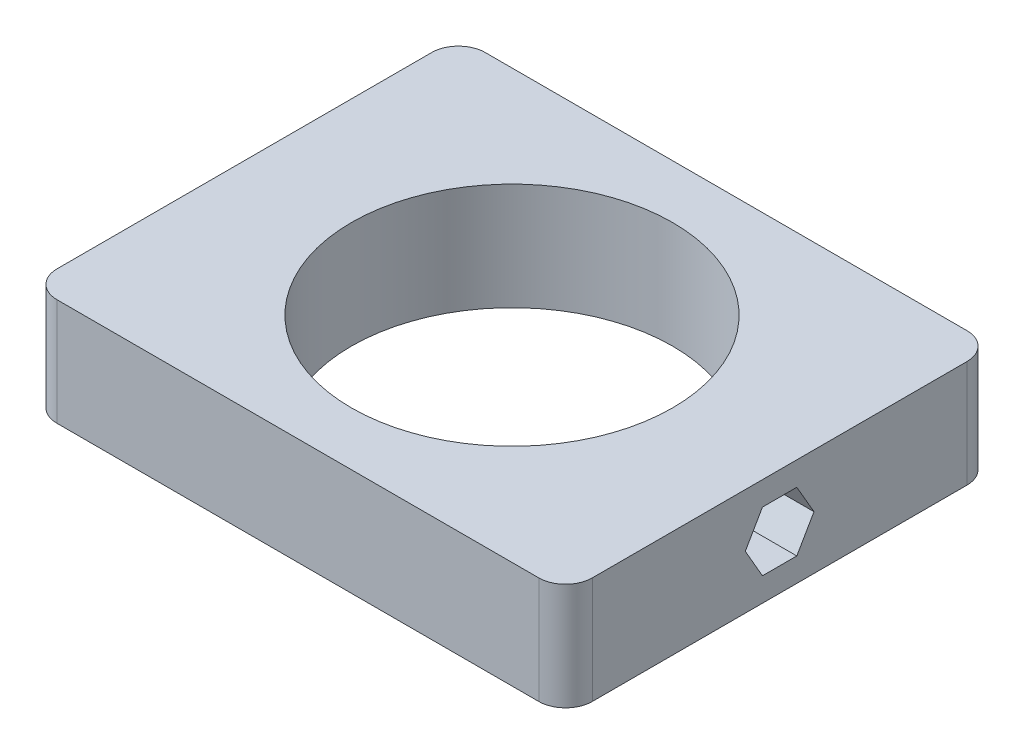
ISO-10303-21;
HEADER;
FILE_DESCRIPTION(('STEP AP214'),'2;1');
FILE_NAME('part.step','',(''),(''),'','','');
FILE_SCHEMA(('AUTOMOTIVE_DESIGN { 1 0 10303 214 1 1 1 1 }'));
ENDSEC;
DATA;
#1=APPLICATION_CONTEXT('core data for automotive mechanical design processes');
#2=APPLICATION_PROTOCOL_DEFINITION('international standard','automotive_design',2000,#1);
#3=PRODUCT_CONTEXT('',#1,'mechanical');
#4=PRODUCT('Part','Part','',(#3));
#5=PRODUCT_RELATED_PRODUCT_CATEGORY('part','',(#4));
#6=PRODUCT_DEFINITION_FORMATION('','',#4);
#7=PRODUCT_DEFINITION_CONTEXT('part definition',#1,'design');
#8=PRODUCT_DEFINITION('design','',#6,#7);
#9=PRODUCT_DEFINITION_SHAPE('','',#8);
#10=(LENGTH_UNIT() NAMED_UNIT(*) SI_UNIT(.MILLI.,.METRE.));
#11=(NAMED_UNIT(*) PLANE_ANGLE_UNIT() SI_UNIT($,.RADIAN.));
#12=(NAMED_UNIT(*) SI_UNIT($,.STERADIAN.) SOLID_ANGLE_UNIT());
#13=UNCERTAINTY_MEASURE_WITH_UNIT(LENGTH_MEASURE(1.E-05),#10,'distance_accuracy_value','');
#14=(GEOMETRIC_REPRESENTATION_CONTEXT(3) GLOBAL_UNCERTAINTY_ASSIGNED_CONTEXT((#13)) GLOBAL_UNIT_ASSIGNED_CONTEXT((#10,
#11,#12)) REPRESENTATION_CONTEXT('',''));
#15=CARTESIAN_POINT('',(0.,0.,0.));
#16=DIRECTION('',(0.,0.,1.));
#17=DIRECTION('',(1.,0.,0.));
#18=AXIS2_PLACEMENT_3D('',#15,#16,#17);
#19=CARTESIAN_POINT('',(57.15,25.4,-44.45));
#20=DIRECTION('',(0.,-1.,0.));
#21=DIRECTION('',(0.,0.,-1.));
#22=AXIS2_PLACEMENT_3D('',#19,#20,#21);
#23=PLANE('',#22);
#24=CARTESIAN_POINT('',(57.15,25.4,-44.45));
#25=DIRECTION('',(0.,1.,0.));
#26=DIRECTION('',(0.,0.,-1.));
#27=AXIS2_PLACEMENT_3D('',#24,#25,#26);
#28=CIRCLE('',#27,6.35);
#29=CARTESIAN_POINT('',(63.5,25.4,-44.45));
#30=VERTEX_POINT('',#29);
#31=CARTESIAN_POINT('',(57.15,25.4,-50.8));
#32=VERTEX_POINT('',#31);
#33=EDGE_CURVE('E271',#30,#32,#28,.T.);
#34=ORIENTED_EDGE('',*,*,#33,.T.);
#35=DIRECTION('',(-1.,0.,0.));
#36=VECTOR('',#35,1.);
#37=CARTESIAN_POINT('',(-57.15,25.4,-50.8));
#38=LINE('',#37,#36);
#39=CARTESIAN_POINT('',(-57.15,25.4,-50.8));
#40=VERTEX_POINT('',#39);
#41=EDGE_CURVE('E275',#32,#40,#38,.T.);
#42=ORIENTED_EDGE('',*,*,#41,.T.);
#43=CARTESIAN_POINT('',(-57.15,25.4,-44.45));
#44=DIRECTION('',(0.,1.,0.));
#45=DIRECTION('',(0.,0.,1.));
#46=AXIS2_PLACEMENT_3D('',#43,#44,#45);
#47=CIRCLE('',#46,6.35);
#48=CARTESIAN_POINT('',(-63.5,25.4,-44.45));
#49=VERTEX_POINT('',#48);
#50=EDGE_CURVE('E279',#40,#49,#47,.T.);
#51=ORIENTED_EDGE('',*,*,#50,.T.);
#52=DIRECTION('',(0.,0.,1.));
#53=VECTOR('',#52,1.);
#54=CARTESIAN_POINT('',(-63.5,25.4,-44.45));
#55=LINE('',#54,#53);
#56=CARTESIAN_POINT('',(-63.5,25.4,44.45));
#57=VERTEX_POINT('',#56);
#58=EDGE_CURVE('E282',#49,#57,#55,.T.);
#59=ORIENTED_EDGE('',*,*,#58,.T.);
#60=CARTESIAN_POINT('',(-57.15,25.4,44.45));
#61=DIRECTION('',(0.,1.,0.));
#62=DIRECTION('',(0.,0.,1.));
#63=AXIS2_PLACEMENT_3D('',#60,#61,#62);
#64=CIRCLE('',#63,6.35000000000001);
#65=CARTESIAN_POINT('',(-57.15,25.4,50.8));
#66=VERTEX_POINT('',#65);
#67=EDGE_CURVE('E285',#57,#66,#64,.T.);
#68=ORIENTED_EDGE('',*,*,#67,.T.);
#69=DIRECTION('',(1.,0.,0.));
#70=VECTOR('',#69,1.);
#71=CARTESIAN_POINT('',(-57.15,25.4,50.8));
#72=LINE('',#71,#70);
#73=CARTESIAN_POINT('',(57.15,25.4,50.8));
#74=VERTEX_POINT('',#73);
#75=EDGE_CURVE('E288',#66,#74,#72,.T.);
#76=ORIENTED_EDGE('',*,*,#75,.T.);
#77=CARTESIAN_POINT('',(57.15,25.4,44.45));
#78=DIRECTION('',(0.,1.,0.));
#79=DIRECTION('',(0.,0.,1.));
#80=AXIS2_PLACEMENT_3D('',#77,#78,#79);
#81=CIRCLE('',#80,6.35000000000001);
#82=CARTESIAN_POINT('',(63.5,25.4,44.45));
#83=VERTEX_POINT('',#82);
#84=EDGE_CURVE('E291',#74,#83,#81,.T.);
#85=ORIENTED_EDGE('',*,*,#84,.T.);
#86=DIRECTION('',(0.,0.,-1.));
#87=VECTOR('',#86,1.);
#88=CARTESIAN_POINT('',(63.5,25.4,-44.45));
#89=LINE('',#88,#87);
#90=EDGE_CURVE('E294',#83,#30,#89,.T.);
#91=ORIENTED_EDGE('',*,*,#90,.T.);
#92=EDGE_LOOP('',(#34,#42,#51,#59,#68,#76,#85,#91));
#93=FACE_BOUND('',#92,.T.);
#94=CARTESIAN_POINT('',(0.,25.4,0.));
#95=DIRECTION('',(0.,1.,0.));
#96=DIRECTION('',(0.,0.,1.));
#97=AXIS2_PLACEMENT_3D('',#94,#95,#96);
#98=CIRCLE('',#97,38.1);
#99=CARTESIAN_POINT('',(0.,25.4,38.1));
#100=VERTEX_POINT('',#99);
#101=EDGE_CURVE('E263',#100,#100,#98,.T.);
#102=ORIENTED_EDGE('',*,*,#101,.F.);
#103=EDGE_LOOP('',(#102));
#104=FACE_BOUND('',#103,.T.);
#105=ADVANCED_FACE('F38',(#93,#104),#23,.F.);
#106=CARTESIAN_POINT('',(57.15,0.,-44.45));
#107=DIRECTION('',(0.,-1.,0.));
#108=DIRECTION('',(0.,0.,-1.));
#109=AXIS2_PLACEMENT_3D('',#106,#107,#108);
#110=PLANE('',#109);
#111=CARTESIAN_POINT('',(57.15,0.,-44.45));
#112=DIRECTION('',(0.,1.,0.));
#113=DIRECTION('',(0.,0.,-1.));
#114=AXIS2_PLACEMENT_3D('',#111,#112,#113);
#115=CIRCLE('',#114,6.35);
#116=CARTESIAN_POINT('',(63.5,0.,-44.45));
#117=VERTEX_POINT('',#116);
#118=CARTESIAN_POINT('',(57.15,0.,-50.8));
#119=VERTEX_POINT('',#118);
#120=EDGE_CURVE('E267',#117,#119,#115,.T.);
#121=ORIENTED_EDGE('',*,*,#120,.F.);
#122=DIRECTION('',(0.,0.,-1.));
#123=VECTOR('',#122,1.);
#124=CARTESIAN_POINT('',(63.5,0.,-44.45));
#125=LINE('',#124,#123);
#126=CARTESIAN_POINT('',(63.5,0.,44.45));
#127=VERTEX_POINT('',#126);
#128=EDGE_CURVE('E276',#127,#117,#125,.T.);
#129=ORIENTED_EDGE('',*,*,#128,.F.);
#130=CARTESIAN_POINT('',(57.15,0.,44.45));
#131=DIRECTION('',(0.,1.,0.));
#132=DIRECTION('',(0.,0.,1.));
#133=AXIS2_PLACEMENT_3D('',#130,#131,#132);
#134=CIRCLE('',#133,6.35000000000001);
#135=CARTESIAN_POINT('',(57.15,0.,50.8));
#136=VERTEX_POINT('',#135);
#137=EDGE_CURVE('E316',#136,#127,#134,.T.);
#138=ORIENTED_EDGE('',*,*,#137,.F.);
#139=DIRECTION('',(1.,0.,0.));
#140=VECTOR('',#139,1.);
#141=CARTESIAN_POINT('',(-57.15,0.,50.8));
#142=LINE('',#141,#140);
#143=CARTESIAN_POINT('',(-57.15,0.,50.8));
#144=VERTEX_POINT('',#143);
#145=EDGE_CURVE('E313',#144,#136,#142,.T.);
#146=ORIENTED_EDGE('',*,*,#145,.F.);
#147=CARTESIAN_POINT('',(-57.15,0.,44.45));
#148=DIRECTION('',(0.,1.,0.));
#149=DIRECTION('',(0.,0.,1.));
#150=AXIS2_PLACEMENT_3D('',#147,#148,#149);
#151=CIRCLE('',#150,6.35000000000001);
#152=CARTESIAN_POINT('',(-63.5,0.,44.45));
#153=VERTEX_POINT('',#152);
#154=EDGE_CURVE('E310',#153,#144,#151,.T.);
#155=ORIENTED_EDGE('',*,*,#154,.F.);
#156=DIRECTION('',(0.,0.,1.));
#157=VECTOR('',#156,1.);
#158=CARTESIAN_POINT('',(-63.5,0.,-44.45));
#159=LINE('',#158,#157);
#160=CARTESIAN_POINT('',(-63.5,0.,-44.45));
#161=VERTEX_POINT('',#160);
#162=EDGE_CURVE('E307',#161,#153,#159,.T.);
#163=ORIENTED_EDGE('',*,*,#162,.F.);
#164=CARTESIAN_POINT('',(-57.15,0.,-44.45));
#165=DIRECTION('',(0.,1.,0.));
#166=DIRECTION('',(0.,0.,1.));
#167=AXIS2_PLACEMENT_3D('',#164,#165,#166);
#168=CIRCLE('',#167,6.35);
#169=CARTESIAN_POINT('',(-57.15,0.,-50.8));
#170=VERTEX_POINT('',#169);
#171=EDGE_CURVE('E304',#170,#161,#168,.T.);
#172=ORIENTED_EDGE('',*,*,#171,.F.);
#173=DIRECTION('',(-1.,0.,0.));
#174=VECTOR('',#173,1.);
#175=CARTESIAN_POINT('',(-57.15,0.,-50.8));
#176=LINE('',#175,#174);
#177=EDGE_CURVE('E301',#119,#170,#176,.T.);
#178=ORIENTED_EDGE('',*,*,#177,.F.);
#179=EDGE_LOOP('',(#121,#129,#138,#146,#155,#163,#172,#178));
#180=FACE_BOUND('',#179,.T.);
#181=CARTESIAN_POINT('',(0.,0.,0.));
#182=DIRECTION('',(0.,1.,0.));
#183=DIRECTION('',(0.,0.,1.));
#184=AXIS2_PLACEMENT_3D('',#181,#182,#183);
#185=CIRCLE('',#184,38.1);
#186=CARTESIAN_POINT('',(0.,0.,38.1));
#187=VERTEX_POINT('',#186);
#188=EDGE_CURVE('E203',#187,#187,#185,.T.);
#189=ORIENTED_EDGE('',*,*,#188,.T.);
#190=EDGE_LOOP('',(#189));
#191=FACE_BOUND('',#190,.T.);
#192=ADVANCED_FACE('F356',(#180,#191),#110,.T.);
#193=CARTESIAN_POINT('',(57.15,25.4,-44.45));
#194=DIRECTION('',(0.,-1.,0.));
#195=DIRECTION('',(0.,0.,-1.));
#196=AXIS2_PLACEMENT_3D('',#193,#194,#195);
#197=CYLINDRICAL_SURFACE('',#196,6.35);
#198=ORIENTED_EDGE('',*,*,#120,.T.);
#199=DIRECTION('',(0.,-1.,0.));
#200=VECTOR('',#199,1.);
#201=CARTESIAN_POINT('',(57.15,25.4,-50.8));
#202=LINE('',#201,#200);
#203=EDGE_CURVE('E11',#32,#119,#202,.T.);
#204=ORIENTED_EDGE('',*,*,#203,.F.);
#205=ORIENTED_EDGE('',*,*,#33,.F.);
#206=DIRECTION('',(0.,-1.,0.));
#207=VECTOR('',#206,1.);
#208=CARTESIAN_POINT('',(63.5,25.4,-44.45));
#209=LINE('',#208,#207);
#210=EDGE_CURVE('E297',#30,#117,#209,.T.);
#211=ORIENTED_EDGE('',*,*,#210,.T.);
#212=EDGE_LOOP('',(#198,#204,#205,#211));
#213=FACE_BOUND('',#212,.T.);
#214=ADVANCED_FACE('F40',(#213),#197,.T.);
#215=CARTESIAN_POINT('',(-57.15,25.4,-50.8));
#216=DIRECTION('',(0.,0.,1.));
#217=DIRECTION('',(1.,0.,0.));
#218=AXIS2_PLACEMENT_3D('',#215,#216,#217);
#219=PLANE('',#218);
#220=DIRECTION('',(-1.,0.,0.));
#221=VECTOR('',#220,1.);
#222=CARTESIAN_POINT('',(-10.5903279720939,3.98449724908603,-50.8));
#223=LINE('',#222,#221);
#224=CARTESIAN_POINT('',(10.5903279720939,3.98449724908603,-50.8));
#225=VERTEX_POINT('',#224);
#226=CARTESIAN_POINT('',(-10.5903279720939,3.98449724908603,-50.8));
#227=VERTEX_POINT('',#226);
#228=EDGE_CURVE('E184',#225,#227,#223,.T.);
#229=ORIENTED_EDGE('',*,*,#228,.F.);
#230=DIRECTION('',(0.5,-0.866025403784439,0.));
#231=VECTOR('',#230,1.);
#232=CARTESIAN_POINT('',(10.5903279720939,3.98449724908603,-50.8));
#233=LINE('',#232,#231);
#234=CARTESIAN_POINT('',(0.,22.3274833655705,-50.8));
#235=VERTEX_POINT('',#234);
#236=EDGE_CURVE('E54',#235,#225,#233,.T.);
#237=ORIENTED_EDGE('',*,*,#236,.F.);
#238=DIRECTION('',(0.5,0.866025403784439,0.));
#239=VECTOR('',#238,1.);
#240=CARTESIAN_POINT('',(0.,22.3274833655705,-50.8));
#241=LINE('',#240,#239);
#242=EDGE_CURVE('E179',#227,#235,#241,.T.);
#243=ORIENTED_EDGE('',*,*,#242,.F.);
#244=EDGE_LOOP('',(#229,#237,#243));
#245=FACE_BOUND('',#244,.T.);
#246=ORIENTED_EDGE('',*,*,#177,.T.);
#247=DIRECTION('',(0.,-1.,0.));
#248=VECTOR('',#247,1.);
#249=CARTESIAN_POINT('',(-57.15,25.4,-50.8));
#250=LINE('',#249,#248);
#251=EDGE_CURVE('E47',#40,#170,#250,.T.);
#252=ORIENTED_EDGE('',*,*,#251,.F.);
#253=ORIENTED_EDGE('',*,*,#41,.F.);
#254=ORIENTED_EDGE('',*,*,#203,.T.);
#255=EDGE_LOOP('',(#246,#252,#253,#254));
#256=FACE_BOUND('',#255,.T.);
#257=ADVANCED_FACE('F374',(#245,#256),#219,.F.);
#258=CARTESIAN_POINT('',(-57.15,25.4,-44.45));
#259=DIRECTION('',(0.,-1.,0.));
#260=DIRECTION('',(0.,0.,-1.));
#261=AXIS2_PLACEMENT_3D('',#258,#259,#260);
#262=CYLINDRICAL_SURFACE('',#261,6.35);
#263=ORIENTED_EDGE('',*,*,#171,.T.);
#264=DIRECTION('',(0.,-1.,0.));
#265=VECTOR('',#264,1.);
#266=CARTESIAN_POINT('',(-63.5,25.4,-44.45));
#267=LINE('',#266,#265);
#268=EDGE_CURVE('E340',#49,#161,#267,.T.);
#269=ORIENTED_EDGE('',*,*,#268,.F.);
#270=ORIENTED_EDGE('',*,*,#50,.F.);
#271=ORIENTED_EDGE('',*,*,#251,.T.);
#272=EDGE_LOOP('',(#263,#269,#270,#271));
#273=FACE_BOUND('',#272,.T.);
#274=ADVANCED_FACE('F350',(#273),#262,.T.);
#275=CARTESIAN_POINT('',(-63.5,25.4,-44.45));
#276=DIRECTION('',(1.,0.,0.));
#277=DIRECTION('',(0.,0.,-1.));
#278=AXIS2_PLACEMENT_3D('',#275,#276,#277);
#279=PLANE('',#278);
#280=ORIENTED_EDGE('',*,*,#162,.T.);
#281=DIRECTION('',(0.,-1.,0.));
#282=VECTOR('',#281,1.);
#283=CARTESIAN_POINT('',(-63.5,25.4,44.45));
#284=LINE('',#283,#282);
#285=EDGE_CURVE('E336',#57,#153,#284,.T.);
#286=ORIENTED_EDGE('',*,*,#285,.F.);
#287=ORIENTED_EDGE('',*,*,#58,.F.);
#288=ORIENTED_EDGE('',*,*,#268,.T.);
#289=EDGE_LOOP('',(#280,#286,#287,#288));
#290=FACE_BOUND('',#289,.T.);
#291=ADVANCED_FACE('F362',(#290),#279,.F.);
#292=CARTESIAN_POINT('',(-57.15,25.4,44.45));
#293=DIRECTION('',(0.,-1.,0.));
#294=DIRECTION('',(0.,0.,-1.));
#295=AXIS2_PLACEMENT_3D('',#292,#293,#294);
#296=CYLINDRICAL_SURFACE('',#295,6.35000000000001);
#297=ORIENTED_EDGE('',*,*,#154,.T.);
#298=DIRECTION('',(0.,-1.,0.));
#299=VECTOR('',#298,1.);
#300=CARTESIAN_POINT('',(-57.15,25.4,50.8));
#301=LINE('',#300,#299);
#302=EDGE_CURVE('E332',#66,#144,#301,.T.);
#303=ORIENTED_EDGE('',*,*,#302,.F.);
#304=ORIENTED_EDGE('',*,*,#67,.F.);
#305=ORIENTED_EDGE('',*,*,#285,.T.);
#306=EDGE_LOOP('',(#297,#303,#304,#305));
#307=FACE_BOUND('',#306,.T.);
#308=ADVANCED_FACE('F366',(#307),#296,.T.);
#309=CARTESIAN_POINT('',(-57.15,25.4,50.8));
#310=DIRECTION('',(0.,0.,-1.));
#311=DIRECTION('',(-1.,0.,0.));
#312=AXIS2_PLACEMENT_3D('',#309,#310,#311);
#313=PLANE('',#312);
#314=ORIENTED_EDGE('',*,*,#145,.T.);
#315=DIRECTION('',(0.,-1.,0.));
#316=VECTOR('',#315,1.);
#317=CARTESIAN_POINT('',(57.15,25.4,50.8));
#318=LINE('',#317,#316);
#319=EDGE_CURVE('E328',#74,#136,#318,.T.);
#320=ORIENTED_EDGE('',*,*,#319,.F.);
#321=ORIENTED_EDGE('',*,*,#75,.F.);
#322=ORIENTED_EDGE('',*,*,#302,.T.);
#323=EDGE_LOOP('',(#314,#320,#321,#322));
#324=FACE_BOUND('',#323,.T.);
#325=ADVANCED_FACE('F387',(#324),#313,.F.);
#326=CARTESIAN_POINT('',(57.15,25.4,44.45));
#327=DIRECTION('',(0.,-1.,0.));
#328=DIRECTION('',(0.,0.,-1.));
#329=AXIS2_PLACEMENT_3D('',#326,#327,#328);
#330=CYLINDRICAL_SURFACE('',#329,6.35000000000001);
#331=ORIENTED_EDGE('',*,*,#137,.T.);
#332=DIRECTION('',(0.,-1.,0.));
#333=VECTOR('',#332,1.);
#334=CARTESIAN_POINT('',(63.5,25.4,44.45));
#335=LINE('',#334,#333);
#336=EDGE_CURVE('E324',#83,#127,#335,.T.);
#337=ORIENTED_EDGE('',*,*,#336,.F.);
#338=ORIENTED_EDGE('',*,*,#84,.F.);
#339=ORIENTED_EDGE('',*,*,#319,.T.);
#340=EDGE_LOOP('',(#331,#337,#338,#339));
#341=FACE_BOUND('',#340,.T.);
#342=ADVANCED_FACE('F385',(#341),#330,.T.);
#343=CARTESIAN_POINT('',(63.5,25.4,-44.45));
#344=DIRECTION('',(-1.,0.,0.));
#345=DIRECTION('',(0.,0.,1.));
#346=AXIS2_PLACEMENT_3D('',#343,#344,#345);
#347=PLANE('',#346);
#348=DIRECTION('',(0.,0.866025403784438,0.500000000000001));
#349=VECTOR('',#348,1.);
#350=CARTESIAN_POINT('',(63.5,12.7,-8.14640613237993));
#351=LINE('',#350,#349);
#352=CARTESIAN_POINT('',(63.5,12.7,-8.14640613237993));
#353=VERTEX_POINT('',#352);
#354=CARTESIAN_POINT('',(63.5,19.7549946601863,-4.07320306618995));
#355=VERTEX_POINT('',#354);
#356=EDGE_CURVE('E62',#353,#355,#351,.T.);
#357=ORIENTED_EDGE('',*,*,#356,.F.);
#358=DIRECTION('',(0.,0.866025403784442,-0.499999999999995));
#359=VECTOR('',#358,1.);
#360=CARTESIAN_POINT('',(63.5,5.64500533981371,-4.07320306619006));
#361=LINE('',#360,#359);
#362=CARTESIAN_POINT('',(63.5,5.64500533981371,-4.07320306619006));
#363=VERTEX_POINT('',#362);
#364=EDGE_CURVE('E218',#363,#353,#361,.T.);
#365=ORIENTED_EDGE('',*,*,#364,.F.);
#366=DIRECTION('',(0.,0.,-1.));
#367=VECTOR('',#366,1.);
#368=CARTESIAN_POINT('',(63.5,5.64500533981362,4.07320306618987));
#369=LINE('',#368,#367);
#370=CARTESIAN_POINT('',(63.5,5.64500533981362,4.07320306618987));
#371=VERTEX_POINT('',#370);
#372=EDGE_CURVE('E199',#371,#363,#369,.T.);
#373=ORIENTED_EDGE('',*,*,#372,.F.);
#374=DIRECTION('',(0.,-0.866025403784434,-0.500000000000007));
#375=VECTOR('',#374,1.);
#376=CARTESIAN_POINT('',(63.5,12.6999999999999,8.14640613237989));
#377=LINE('',#376,#375);
#378=CARTESIAN_POINT('',(63.5,12.6999999999999,8.14640613237989));
#379=VERTEX_POINT('',#378);
#380=EDGE_CURVE('E204',#379,#371,#377,.T.);
#381=ORIENTED_EDGE('',*,*,#380,.F.);
#382=DIRECTION('',(0.,-0.866025403784441,0.499999999999995));
#383=VECTOR('',#382,1.);
#384=CARTESIAN_POINT('',(63.5,19.7549946601863,4.07320306618997));
#385=LINE('',#384,#383);
#386=CARTESIAN_POINT('',(63.5,19.7549946601863,4.07320306618997));
#387=VERTEX_POINT('',#386);
#388=EDGE_CURVE('E208',#387,#379,#385,.T.);
#389=ORIENTED_EDGE('',*,*,#388,.F.);
#390=DIRECTION('',(0.,0.,1.));
#391=VECTOR('',#390,1.);
#392=CARTESIAN_POINT('',(63.5,19.7549946601863,-4.07320306618996));
#393=LINE('',#392,#391);
#394=EDGE_CURVE('E212',#355,#387,#393,.T.);
#395=ORIENTED_EDGE('',*,*,#394,.F.);
#396=EDGE_LOOP('',(#357,#365,#373,#381,#389,#395));
#397=FACE_BOUND('',#396,.T.);
#398=ORIENTED_EDGE('',*,*,#128,.T.);
#399=ORIENTED_EDGE('',*,*,#210,.F.);
#400=ORIENTED_EDGE('',*,*,#90,.F.);
#401=ORIENTED_EDGE('',*,*,#336,.T.);
#402=EDGE_LOOP('',(#398,#399,#400,#401));
#403=FACE_BOUND('',#402,.T.);
#404=ADVANCED_FACE('F380',(#397,#403),#347,.F.);
#405=CARTESIAN_POINT('',(0.,25.4,0.));
#406=DIRECTION('',(0.,-1.,0.));
#407=DIRECTION('',(0.,0.,-1.));
#408=AXIS2_PLACEMENT_3D('',#405,#406,#407);
#409=CYLINDRICAL_SURFACE('',#408,38.1);
#410=CARTESIAN_POINT('',(0.,-1.40998932037283,0.));
#411=DIRECTION('',(0.,-0.499999999999995,-0.866025403784442));
#412=DIRECTION('',(0.,-0.866025403784442,0.499999999999995));
#413=AXIS2_PLACEMENT_3D('',#410,#411,#412);
#414=ELLIPSE('',#413,76.2000000000008,38.1);
#415=CARTESIAN_POINT('',(37.8816448531684,5.64500533981371,-4.07320306619005));
#416=VERTEX_POINT('',#415);
#417=CARTESIAN_POINT('',(37.2188939535597,12.7,-8.14640613237992));
#418=VERTEX_POINT('',#417);
#419=EDGE_CURVE('E196',#416,#418,#414,.F.);
#420=ORIENTED_EDGE('',*,*,#419,.T.);
#421=CARTESIAN_POINT('',(0.,26.8099893203726,0.));
#422=DIRECTION('',(0.,0.500000000000001,-0.866025403784438));
#423=DIRECTION('',(0.,-0.866025403784438,-0.500000000000001));
#424=AXIS2_PLACEMENT_3D('',#421,#422,#423);
#425=ELLIPSE('',#424,76.1999999999998,38.1);
#426=CARTESIAN_POINT('',(37.8816448531684,19.7549946601863,-4.07320306618995));
#427=VERTEX_POINT('',#426);
#428=EDGE_CURVE('E223',#418,#427,#425,.F.);
#429=ORIENTED_EDGE('',*,*,#428,.T.);
#430=CARTESIAN_POINT('',(0.,19.7549946601863,0.));
#431=DIRECTION('',(0.,1.,0.));
#432=DIRECTION('',(0.,0.,1.));
#433=AXIS2_PLACEMENT_3D('',#430,#431,#432);
#434=CIRCLE('',#433,38.1);
#435=CARTESIAN_POINT('',(37.8816448531684,19.7549946601863,4.07320306618997));
#436=VERTEX_POINT('',#435);
#437=EDGE_CURVE('E241',#427,#436,#434,.F.);
#438=ORIENTED_EDGE('',*,*,#437,.T.);
#439=CARTESIAN_POINT('',(0.,26.8099893203728,0.));
#440=DIRECTION('',(0.,0.499999999999995,0.866025403784441));
#441=DIRECTION('',(0.,-0.866025403784442,0.499999999999995));
#442=AXIS2_PLACEMENT_3D('',#439,#440,#441);
#443=ELLIPSE('',#442,76.2000000000008,38.1);
#444=CARTESIAN_POINT('',(37.2188939535597,12.6999999999999,8.1464061323799));
#445=VERTEX_POINT('',#444);
#446=EDGE_CURVE('E237',#436,#445,#443,.F.);
#447=ORIENTED_EDGE('',*,*,#446,.T.);
#448=CARTESIAN_POINT('',(0.,-1.4099893203725,0.));
#449=DIRECTION('',(0.,-0.500000000000007,0.866025403784435));
#450=DIRECTION('',(0.,-0.866025403784435,-0.500000000000007));
#451=AXIS2_PLACEMENT_3D('',#448,#449,#450);
#452=ELLIPSE('',#451,76.1999999999989,38.1);
#453=CARTESIAN_POINT('',(37.8816448531684,5.64500533981362,4.07320306618988));
#454=VERTEX_POINT('',#453);
#455=EDGE_CURVE('E232',#445,#454,#452,.F.);
#456=ORIENTED_EDGE('',*,*,#455,.T.);
#457=CARTESIAN_POINT('',(0.,5.64500533981366,0.));
#458=DIRECTION('',(0.,-1.,0.));
#459=DIRECTION('',(0.,0.,-1.));
#460=AXIS2_PLACEMENT_3D('',#457,#458,#459);
#461=CIRCLE('',#460,38.1);
#462=EDGE_CURVE('E233',#454,#416,#461,.F.);
#463=ORIENTED_EDGE('',*,*,#462,.T.);
#464=EDGE_LOOP('',(#420,#429,#438,#447,#456,#463));
#465=FACE_BOUND('',#464,.T.);
#466=ORIENTED_EDGE('',*,*,#101,.T.);
#467=EDGE_LOOP('',(#466));
#468=FACE_BOUND('',#467,.T.);
#469=ORIENTED_EDGE('',*,*,#188,.F.);
#470=EDGE_LOOP('',(#469));
#471=FACE_BOUND('',#470,.T.);
#472=ADVANCED_FACE('F403',(#465,#468,#471),#409,.F.);
#473=CARTESIAN_POINT('',(-63.501,5.64500533981371,-4.07320306619002));
#474=DIRECTION('',(0.,-0.499999999999995,-0.866025403784442));
#475=DIRECTION('',(0.,0.866025403784442,-0.499999999999995));
#476=AXIS2_PLACEMENT_3D('',#473,#474,#475);
#477=PLANE('',#476);
#478=DIRECTION('',(1.,0.,0.));
#479=VECTOR('',#478,1.);
#480=CARTESIAN_POINT('',(-63.501,5.64500533981371,-4.07320306619002));
#481=LINE('',#480,#479);
#482=EDGE_CURVE('E229',#416,#363,#481,.T.);
#483=ORIENTED_EDGE('',*,*,#482,.T.);
#484=ORIENTED_EDGE('',*,*,#364,.T.);
#485=DIRECTION('',(1.,0.,0.));
#486=VECTOR('',#485,1.);
#487=CARTESIAN_POINT('',(-63.501,12.7,-8.14640613237989));
#488=LINE('',#487,#486);
#489=EDGE_CURVE('E228',#418,#353,#488,.T.);
#490=ORIENTED_EDGE('',*,*,#489,.F.);
#491=ORIENTED_EDGE('',*,*,#419,.F.);
#492=EDGE_LOOP('',(#483,#484,#490,#491));
#493=FACE_BOUND('',#492,.T.);
#494=ADVANCED_FACE('F411',(#493),#477,.F.);
#495=CARTESIAN_POINT('',(-63.501,12.7,-8.14640613237989));
#496=DIRECTION('',(0.,0.500000000000001,-0.866025403784438));
#497=DIRECTION('',(0.,0.866025403784438,0.500000000000001));
#498=AXIS2_PLACEMENT_3D('',#495,#496,#497);
#499=PLANE('',#498);
#500=ORIENTED_EDGE('',*,*,#489,.T.);
#501=ORIENTED_EDGE('',*,*,#356,.T.);
#502=DIRECTION('',(1.,0.,0.));
#503=VECTOR('',#502,1.);
#504=CARTESIAN_POINT('',(-63.501,19.7549946601863,-4.07320306618992));
#505=LINE('',#504,#503);
#506=EDGE_CURVE('E227',#427,#355,#505,.T.);
#507=ORIENTED_EDGE('',*,*,#506,.F.);
#508=ORIENTED_EDGE('',*,*,#428,.F.);
#509=EDGE_LOOP('',(#500,#501,#507,#508));
#510=FACE_BOUND('',#509,.T.);
#511=ADVANCED_FACE('F421',(#510),#499,.F.);
#512=CARTESIAN_POINT('',(-63.501,5.64500533981362,4.07320306618991));
#513=DIRECTION('',(0.,-1.,0.));
#514=DIRECTION('',(0.,0.,-1.));
#515=AXIS2_PLACEMENT_3D('',#512,#513,#514);
#516=PLANE('',#515);
#517=DIRECTION('',(1.,0.,0.));
#518=VECTOR('',#517,1.);
#519=CARTESIAN_POINT('',(-63.501,5.64500533981362,4.07320306618991));
#520=LINE('',#519,#518);
#521=EDGE_CURVE('E234',#454,#371,#520,.T.);
#522=ORIENTED_EDGE('',*,*,#521,.T.);
#523=ORIENTED_EDGE('',*,*,#372,.T.);
#524=ORIENTED_EDGE('',*,*,#482,.F.);
#525=ORIENTED_EDGE('',*,*,#462,.F.);
#526=EDGE_LOOP('',(#522,#523,#524,#525));
#527=FACE_BOUND('',#526,.T.);
#528=ADVANCED_FACE('F427',(#527),#516,.F.);
#529=CARTESIAN_POINT('',(-63.501,12.6999999999999,8.14640613237993));
#530=DIRECTION('',(0.,-0.500000000000007,0.866025403784435));
#531=DIRECTION('',(0.,-0.866025403784435,-0.500000000000007));
#532=AXIS2_PLACEMENT_3D('',#529,#530,#531);
#533=PLANE('',#532);
#534=DIRECTION('',(1.,0.,0.));
#535=VECTOR('',#534,1.);
#536=CARTESIAN_POINT('',(-63.501,12.6999999999999,8.14640613237993));
#537=LINE('',#536,#535);
#538=EDGE_CURVE('E238',#445,#379,#537,.T.);
#539=ORIENTED_EDGE('',*,*,#538,.T.);
#540=ORIENTED_EDGE('',*,*,#380,.T.);
#541=ORIENTED_EDGE('',*,*,#521,.F.);
#542=ORIENTED_EDGE('',*,*,#455,.F.);
#543=EDGE_LOOP('',(#539,#540,#541,#542));
#544=FACE_BOUND('',#543,.T.);
#545=ADVANCED_FACE('F430',(#544),#533,.F.);
#546=CARTESIAN_POINT('',(-63.501,19.7549946601863,4.07320306619001));
#547=DIRECTION('',(0.,0.499999999999995,0.866025403784441));
#548=DIRECTION('',(0.,-0.866025403784442,0.499999999999995));
#549=AXIS2_PLACEMENT_3D('',#546,#547,#548);
#550=PLANE('',#549);
#551=DIRECTION('',(1.,0.,0.));
#552=VECTOR('',#551,1.);
#553=CARTESIAN_POINT('',(-63.501,19.7549946601863,4.07320306619001));
#554=LINE('',#553,#552);
#555=EDGE_CURVE('E222',#436,#387,#554,.T.);
#556=ORIENTED_EDGE('',*,*,#555,.T.);
#557=ORIENTED_EDGE('',*,*,#388,.T.);
#558=ORIENTED_EDGE('',*,*,#538,.F.);
#559=ORIENTED_EDGE('',*,*,#446,.F.);
#560=EDGE_LOOP('',(#556,#557,#558,#559));
#561=FACE_BOUND('',#560,.T.);
#562=ADVANCED_FACE('F433',(#561),#550,.F.);
#563=CARTESIAN_POINT('',(-63.501,19.7549946601863,-4.07320306618992));
#564=DIRECTION('',(0.,1.,0.));
#565=DIRECTION('',(0.,0.,1.));
#566=AXIS2_PLACEMENT_3D('',#563,#564,#565);
#567=PLANE('',#566);
#568=ORIENTED_EDGE('',*,*,#506,.T.);
#569=ORIENTED_EDGE('',*,*,#394,.T.);
#570=ORIENTED_EDGE('',*,*,#555,.F.);
#571=ORIENTED_EDGE('',*,*,#437,.F.);
#572=EDGE_LOOP('',(#568,#569,#570,#571));
#573=FACE_BOUND('',#572,.T.);
#574=ADVANCED_FACE('F419',(#573),#567,.F.);
#575=CARTESIAN_POINT('',(10.5903279720939,3.98449724908603,-44.45));
#576=DIRECTION('',(0.866025403784439,0.5,0.));
#577=DIRECTION('',(-0.5,0.866025403784439,0.));
#578=AXIS2_PLACEMENT_3D('',#575,#576,#577);
#579=PLANE('',#578);
#580=ORIENTED_EDGE('',*,*,#236,.T.);
#581=DIRECTION('',(0.,0.,-1.));
#582=VECTOR('',#581,1.);
#583=CARTESIAN_POINT('',(10.5903279720939,3.98449724908603,-44.45));
#584=LINE('',#583,#582);
#585=CARTESIAN_POINT('',(10.5903279720939,3.98449724908603,-44.45));
#586=VERTEX_POINT('',#585);
#587=EDGE_CURVE('E157',#586,#225,#584,.T.);
#588=ORIENTED_EDGE('',*,*,#587,.F.);
#589=DIRECTION('',(0.5,-0.866025403784439,0.));
#590=VECTOR('',#589,1.);
#591=CARTESIAN_POINT('',(10.5903279720939,3.98449724908603,-44.45));
#592=LINE('',#591,#590);
#593=CARTESIAN_POINT('',(0.,22.3274833655705,-44.45));
#594=VERTEX_POINT('',#593);
#595=EDGE_CURVE('E161',#594,#586,#592,.T.);
#596=ORIENTED_EDGE('',*,*,#595,.F.);
#597=DIRECTION('',(0.,0.,-1.));
#598=VECTOR('',#597,1.);
#599=CARTESIAN_POINT('',(0.,22.3274833655705,-44.45));
#600=LINE('',#599,#598);
#601=EDGE_CURVE('E193',#594,#235,#600,.T.);
#602=ORIENTED_EDGE('',*,*,#601,.T.);
#603=EDGE_LOOP('',(#580,#588,#596,#602));
#604=FACE_BOUND('',#603,.T.);
#605=ADVANCED_FACE('F159',(#604),#579,.F.);
#606=CARTESIAN_POINT('',(0.,22.3274833655705,-44.45));
#607=DIRECTION('',(-0.866025403784439,0.5,0.));
#608=DIRECTION('',(-0.5,-0.866025403784439,0.));
#609=AXIS2_PLACEMENT_3D('',#606,#607,#608);
#610=PLANE('',#609);
#611=ORIENTED_EDGE('',*,*,#242,.T.);
#612=ORIENTED_EDGE('',*,*,#601,.F.);
#613=DIRECTION('',(0.5,0.866025403784439,0.));
#614=VECTOR('',#613,1.);
#615=CARTESIAN_POINT('',(0.,22.3274833655705,-44.45));
#616=LINE('',#615,#614);
#617=CARTESIAN_POINT('',(-10.5903279720939,3.98449724908603,-44.45));
#618=VERTEX_POINT('',#617);
#619=EDGE_CURVE('E168',#618,#594,#616,.T.);
#620=ORIENTED_EDGE('',*,*,#619,.F.);
#621=DIRECTION('',(0.,0.,-1.));
#622=VECTOR('',#621,1.);
#623=CARTESIAN_POINT('',(-10.5903279720939,3.98449724908603,-44.45));
#624=LINE('',#623,#622);
#625=EDGE_CURVE('E167',#618,#227,#624,.T.);
#626=ORIENTED_EDGE('',*,*,#625,.T.);
#627=EDGE_LOOP('',(#611,#612,#620,#626));
#628=FACE_BOUND('',#627,.T.);
#629=ADVANCED_FACE('F454',(#628),#610,.F.);
#630=CARTESIAN_POINT('',(-10.5903279720939,3.98449724908603,-44.45));
#631=DIRECTION('',(0.,-1.,0.));
#632=DIRECTION('',(0.,0.,-1.));
#633=AXIS2_PLACEMENT_3D('',#630,#631,#632);
#634=PLANE('',#633);
#635=ORIENTED_EDGE('',*,*,#228,.T.);
#636=ORIENTED_EDGE('',*,*,#625,.F.);
#637=DIRECTION('',(-1.,0.,0.));
#638=VECTOR('',#637,1.);
#639=CARTESIAN_POINT('',(-10.5903279720939,3.98449724908603,-44.45));
#640=LINE('',#639,#638);
#641=EDGE_CURVE('E171',#586,#618,#640,.T.);
#642=ORIENTED_EDGE('',*,*,#641,.F.);
#643=ORIENTED_EDGE('',*,*,#587,.T.);
#644=EDGE_LOOP('',(#635,#636,#642,#643));
#645=FACE_BOUND('',#644,.T.);
#646=ADVANCED_FACE('F172',(#645),#634,.F.);
#647=CARTESIAN_POINT('',(0.,0.,-44.45));
#648=DIRECTION('',(0.,0.,1.));
#649=DIRECTION('',(1.,0.,0.));
#650=AXIS2_PLACEMENT_3D('',#647,#648,#649);
#651=PLANE('',#650);
#652=ORIENTED_EDGE('',*,*,#595,.T.);
#653=ORIENTED_EDGE('',*,*,#641,.T.);
#654=ORIENTED_EDGE('',*,*,#619,.T.);
#655=EDGE_LOOP('',(#652,#653,#654));
#656=FACE_BOUND('',#655,.T.);
#657=ADVANCED_FACE('F177',(#656),#651,.F.);
#658=CLOSED_SHELL('',(#105,#192,#214,#257,#274,#291,#308,#325,#342,#404,#472,#494,#511,#528,
#545,#562,#574,#605,#629,#646,#657));
#659=MANIFOLD_SOLID_BREP('B2',#658);
#660=ADVANCED_BREP_SHAPE_REPRESENTATION('',(#18,#659),#14);
#661=SHAPE_DEFINITION_REPRESENTATION(#9,#660);
ENDSEC;
END-ISO-10303-21;
